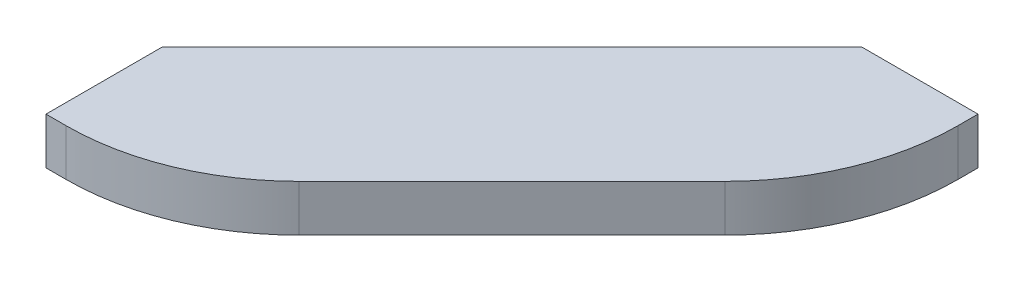
ISO-10303-21;
HEADER;
FILE_DESCRIPTION(('STEP AP214'),'2;1');
FILE_NAME('part.step','',(''),(''),'','','');
FILE_SCHEMA(('AUTOMOTIVE_DESIGN { 1 0 10303 214 1 1 1 1 }'));
ENDSEC;
DATA;
#1=APPLICATION_CONTEXT('core data for automotive mechanical design processes');
#2=APPLICATION_PROTOCOL_DEFINITION('international standard','automotive_design',2000,#1);
#3=PRODUCT_CONTEXT('',#1,'mechanical');
#4=PRODUCT('Part','Part','',(#3));
#5=PRODUCT_RELATED_PRODUCT_CATEGORY('part','',(#4));
#6=PRODUCT_DEFINITION_FORMATION('','',#4);
#7=PRODUCT_DEFINITION_CONTEXT('part definition',#1,'design');
#8=PRODUCT_DEFINITION('design','',#6,#7);
#9=PRODUCT_DEFINITION_SHAPE('','',#8);
#10=(LENGTH_UNIT() NAMED_UNIT(*) SI_UNIT(.MILLI.,.METRE.));
#11=(NAMED_UNIT(*) PLANE_ANGLE_UNIT() SI_UNIT($,.RADIAN.));
#12=(NAMED_UNIT(*) SI_UNIT($,.STERADIAN.) SOLID_ANGLE_UNIT());
#13=UNCERTAINTY_MEASURE_WITH_UNIT(LENGTH_MEASURE(1.E-05),#10,'distance_accuracy_value','');
#14=(GEOMETRIC_REPRESENTATION_CONTEXT(3) GLOBAL_UNCERTAINTY_ASSIGNED_CONTEXT((#13)) GLOBAL_UNIT_ASSIGNED_CONTEXT((#10,
#11,#12)) REPRESENTATION_CONTEXT('',''));
#15=CARTESIAN_POINT('',(0.,0.,0.));
#16=DIRECTION('',(0.,0.,1.));
#17=DIRECTION('',(1.,0.,0.));
#18=AXIS2_PLACEMENT_3D('',#15,#16,#17);
#19=CARTESIAN_POINT('',(25.4,5.08,25.4));
#20=DIRECTION('',(-1.,0.,0.));
#21=DIRECTION('',(0.,0.,1.));
#22=AXIS2_PLACEMENT_3D('',#19,#20,#21);
#23=PLANE('',#22);
#24=DIRECTION('',(0.,0.,-1.));
#25=VECTOR('',#24,1.);
#26=CARTESIAN_POINT('',(25.4,5.08,25.4));
#27=LINE('',#26,#25);
#28=CARTESIAN_POINT('',(25.4,5.08,-23.2210244842766));
#29=VERTEX_POINT('',#28);
#30=CARTESIAN_POINT('',(25.4,5.08,-25.4));
#31=VERTEX_POINT('',#30);
#32=EDGE_CURVE('E123',#29,#31,#27,.T.);
#33=ORIENTED_EDGE('',*,*,#32,.F.);
#34=DIRECTION('',(0.,1.,0.));
#35=VECTOR('',#34,1.);
#36=CARTESIAN_POINT('',(25.4,5.08,-23.2210244842766));
#37=LINE('',#36,#35);
#38=CARTESIAN_POINT('',(25.4,0.,-23.2210244842766));
#39=VERTEX_POINT('',#38);
#40=EDGE_CURVE('E55',#29,#39,#37,.F.);
#41=ORIENTED_EDGE('',*,*,#40,.T.);
#42=DIRECTION('',(0.,0.,-1.));
#43=VECTOR('',#42,1.);
#44=CARTESIAN_POINT('',(25.4,0.,25.4));
#45=LINE('',#44,#43);
#46=CARTESIAN_POINT('',(25.4,0.,-25.4));
#47=VERTEX_POINT('',#46);
#48=EDGE_CURVE('E134',#39,#47,#45,.T.);
#49=ORIENTED_EDGE('',*,*,#48,.T.);
#50=DIRECTION('',(0.,-1.,0.));
#51=VECTOR('',#50,1.);
#52=CARTESIAN_POINT('',(25.4,5.08,-25.4));
#53=LINE('',#52,#51);
#54=EDGE_CURVE('E142',#31,#47,#53,.T.);
#55=ORIENTED_EDGE('',*,*,#54,.F.);
#56=EDGE_LOOP('',(#33,#41,#49,#55));
#57=FACE_BOUND('',#56,.T.);
#58=ADVANCED_FACE('F32',(#57),#23,.F.);
#59=CARTESIAN_POINT('',(-25.4,5.08,-25.4));
#60=DIRECTION('',(0.,0.,1.));
#61=DIRECTION('',(1.,0.,0.));
#62=AXIS2_PLACEMENT_3D('',#59,#60,#61);
#63=PLANE('',#62);
#64=DIRECTION('',(-1.,0.,0.));
#65=VECTOR('',#64,1.);
#66=CARTESIAN_POINT('',(-25.4,0.,-25.4));
#67=LINE('',#66,#65);
#68=CARTESIAN_POINT('',(12.7,0.,-25.4));
#69=VERTEX_POINT('',#68);
#70=EDGE_CURVE('E119',#47,#69,#67,.T.);
#71=ORIENTED_EDGE('',*,*,#70,.T.);
#72=DIRECTION('',(0.,1.,0.));
#73=VECTOR('',#72,1.);
#74=CARTESIAN_POINT('',(12.7,-45.72,-25.4));
#75=LINE('',#74,#73);
#76=CARTESIAN_POINT('',(12.7,5.08,-25.4));
#77=VERTEX_POINT('',#76);
#78=EDGE_CURVE('E102',#69,#77,#75,.T.);
#79=ORIENTED_EDGE('',*,*,#78,.T.);
#80=DIRECTION('',(-1.,0.,0.));
#81=VECTOR('',#80,1.);
#82=CARTESIAN_POINT('',(-25.4,5.08,-25.4));
#83=LINE('',#82,#81);
#84=EDGE_CURVE('E116',#31,#77,#83,.T.);
#85=ORIENTED_EDGE('',*,*,#84,.F.);
#86=ORIENTED_EDGE('',*,*,#54,.T.);
#87=EDGE_LOOP('',(#71,#79,#85,#86));
#88=FACE_BOUND('',#87,.T.);
#89=ADVANCED_FACE('F114',(#88),#63,.F.);
#90=CARTESIAN_POINT('',(-25.4,5.08,25.4));
#91=DIRECTION('',(1.,0.,0.));
#92=DIRECTION('',(0.,0.,-1.));
#93=AXIS2_PLACEMENT_3D('',#90,#91,#92);
#94=PLANE('',#93);
#95=DIRECTION('',(0.,0.,1.));
#96=VECTOR('',#95,1.);
#97=CARTESIAN_POINT('',(-25.4,5.08,25.4));
#98=LINE('',#97,#96);
#99=CARTESIAN_POINT('',(-25.4,5.08,12.7));
#100=VERTEX_POINT('',#99);
#101=CARTESIAN_POINT('',(-25.4,5.08,25.4));
#102=VERTEX_POINT('',#101);
#103=EDGE_CURVE('E124',#100,#102,#98,.T.);
#104=ORIENTED_EDGE('',*,*,#103,.F.);
#105=DIRECTION('',(0.,1.,0.));
#106=VECTOR('',#105,1.);
#107=CARTESIAN_POINT('',(-25.4,-45.72,12.7));
#108=LINE('',#107,#106);
#109=CARTESIAN_POINT('',(-25.4,0.,12.7));
#110=VERTEX_POINT('',#109);
#111=EDGE_CURVE('E105',#110,#100,#108,.T.);
#112=ORIENTED_EDGE('',*,*,#111,.F.);
#113=DIRECTION('',(0.,0.,1.));
#114=VECTOR('',#113,1.);
#115=CARTESIAN_POINT('',(-25.4,0.,25.4));
#116=LINE('',#115,#114);
#117=CARTESIAN_POINT('',(-25.4,0.,25.4));
#118=VERTEX_POINT('',#117);
#119=EDGE_CURVE('E137',#110,#118,#116,.T.);
#120=ORIENTED_EDGE('',*,*,#119,.T.);
#121=DIRECTION('',(0.,-1.,0.));
#122=VECTOR('',#121,1.);
#123=CARTESIAN_POINT('',(-25.4,5.08,25.4));
#124=LINE('',#123,#122);
#125=EDGE_CURVE('E133',#102,#118,#124,.T.);
#126=ORIENTED_EDGE('',*,*,#125,.F.);
#127=EDGE_LOOP('',(#104,#112,#120,#126));
#128=FACE_BOUND('',#127,.T.);
#129=ADVANCED_FACE('F170',(#128),#94,.F.);
#130=CARTESIAN_POINT('',(-25.4,5.08,25.4));
#131=DIRECTION('',(0.,0.,-1.));
#132=DIRECTION('',(-1.,0.,0.));
#133=AXIS2_PLACEMENT_3D('',#130,#131,#132);
#134=PLANE('',#133);
#135=DIRECTION('',(1.,0.,0.));
#136=VECTOR('',#135,1.);
#137=CARTESIAN_POINT('',(-25.4,0.,25.4));
#138=LINE('',#137,#136);
#139=CARTESIAN_POINT('',(-23.2210244842766,0.,25.4));
#140=VERTEX_POINT('',#139);
#141=EDGE_CURVE('E128',#118,#140,#138,.T.);
#142=ORIENTED_EDGE('',*,*,#141,.T.);
#143=DIRECTION('',(0.,1.,0.));
#144=VECTOR('',#143,1.);
#145=CARTESIAN_POINT('',(-23.2210244842766,5.08,25.4));
#146=LINE('',#145,#144);
#147=CARTESIAN_POINT('',(-23.2210244842766,5.08,25.4));
#148=VERTEX_POINT('',#147);
#149=EDGE_CURVE('E11',#140,#148,#146,.T.);
#150=ORIENTED_EDGE('',*,*,#149,.T.);
#151=DIRECTION('',(1.,0.,0.));
#152=VECTOR('',#151,1.);
#153=CARTESIAN_POINT('',(-25.4,5.08,25.4));
#154=LINE('',#153,#152);
#155=EDGE_CURVE('E126',#102,#148,#154,.T.);
#156=ORIENTED_EDGE('',*,*,#155,.F.);
#157=ORIENTED_EDGE('',*,*,#125,.T.);
#158=EDGE_LOOP('',(#142,#150,#156,#157));
#159=FACE_BOUND('',#158,.T.);
#160=ADVANCED_FACE('F178',(#159),#134,.F.);
#161=CARTESIAN_POINT('',(0.,5.08,0.));
#162=DIRECTION('',(0.,-1.,0.));
#163=DIRECTION('',(0.,0.,-1.));
#164=AXIS2_PLACEMENT_3D('',#161,#162,#163);
#165=PLANE('',#164);
#166=DIRECTION('',(-0.707106781186547,0.,0.707106781186548));
#167=VECTOR('',#166,1.);
#168=CARTESIAN_POINT('',(25.4,5.08,-12.7));
#169=LINE('',#168,#167);
#170=CARTESIAN_POINT('',(17.9605122421383,5.08,-5.26051224213832));
#171=VERTEX_POINT('',#170);
#172=CARTESIAN_POINT('',(-5.26051224213828,5.08,17.9605122421383));
#173=VERTEX_POINT('',#172);
#174=EDGE_CURVE('E109',#171,#173,#169,.T.);
#175=ORIENTED_EDGE('',*,*,#174,.F.);
#176=CARTESIAN_POINT('',(0.,5.08,-23.2210244842766));
#177=DIRECTION('',(0.,-1.,0.));
#178=DIRECTION('',(0.,0.,-1.));
#179=AXIS2_PLACEMENT_3D('',#176,#177,#178);
#180=CIRCLE('',#179,25.4);
#181=EDGE_CURVE('E156',#171,#29,#180,.F.);
#182=ORIENTED_EDGE('',*,*,#181,.T.);
#183=ORIENTED_EDGE('',*,*,#32,.T.);
#184=ORIENTED_EDGE('',*,*,#84,.T.);
#185=DIRECTION('',(0.707106781186547,0.,-0.707106781186548));
#186=VECTOR('',#185,1.);
#187=CARTESIAN_POINT('',(-25.4,5.08,12.7));
#188=LINE('',#187,#186);
#189=EDGE_CURVE('E99',#100,#77,#188,.T.);
#190=ORIENTED_EDGE('',*,*,#189,.F.);
#191=ORIENTED_EDGE('',*,*,#103,.T.);
#192=ORIENTED_EDGE('',*,*,#155,.T.);
#193=CARTESIAN_POINT('',(-23.2210244842766,5.08,0.));
#194=DIRECTION('',(0.,-1.,0.));
#195=DIRECTION('',(0.,0.,-1.));
#196=AXIS2_PLACEMENT_3D('',#193,#194,#195);
#197=CIRCLE('',#196,25.4);
#198=EDGE_CURVE('E154',#148,#173,#197,.F.);
#199=ORIENTED_EDGE('',*,*,#198,.T.);
#200=EDGE_LOOP('',(#175,#182,#183,#184,#190,#191,#192,#199));
#201=FACE_BOUND('',#200,.T.);
#202=ADVANCED_FACE('F122',(#201),#165,.F.);
#203=CARTESIAN_POINT('',(0.,0.,0.));
#204=DIRECTION('',(0.,-1.,0.));
#205=DIRECTION('',(0.,0.,-1.));
#206=AXIS2_PLACEMENT_3D('',#203,#204,#205);
#207=PLANE('',#206);
#208=ORIENTED_EDGE('',*,*,#48,.F.);
#209=CARTESIAN_POINT('',(0.,0.,-23.2210244842766));
#210=DIRECTION('',(0.,-1.,0.));
#211=DIRECTION('',(0.,0.,-1.));
#212=AXIS2_PLACEMENT_3D('',#209,#210,#211);
#213=CIRCLE('',#212,25.4);
#214=CARTESIAN_POINT('',(17.9605122421383,0.,-5.26051224213832));
#215=VERTEX_POINT('',#214);
#216=EDGE_CURVE('E40',#39,#215,#213,.T.);
#217=ORIENTED_EDGE('',*,*,#216,.T.);
#218=DIRECTION('',(0.707106781186547,0.,-0.707106781186548));
#219=VECTOR('',#218,1.);
#220=CARTESIAN_POINT('',(6.35000000000001,0.,6.35));
#221=LINE('',#220,#219);
#222=CARTESIAN_POINT('',(-5.26051224213827,0.,17.9605122421383));
#223=VERTEX_POINT('',#222);
#224=EDGE_CURVE('E146',#223,#215,#221,.T.);
#225=ORIENTED_EDGE('',*,*,#224,.F.);
#226=CARTESIAN_POINT('',(-23.2210244842766,0.,0.));
#227=DIRECTION('',(0.,-1.,0.));
#228=DIRECTION('',(0.,0.,-1.));
#229=AXIS2_PLACEMENT_3D('',#226,#227,#228);
#230=CIRCLE('',#229,25.4);
#231=EDGE_CURVE('E47',#223,#140,#230,.T.);
#232=ORIENTED_EDGE('',*,*,#231,.T.);
#233=ORIENTED_EDGE('',*,*,#141,.F.);
#234=ORIENTED_EDGE('',*,*,#119,.F.);
#235=DIRECTION('',(-0.707106781186547,0.,0.707106781186548));
#236=VECTOR('',#235,1.);
#237=CARTESIAN_POINT('',(-6.35000000000001,0.,-6.35));
#238=LINE('',#237,#236);
#239=EDGE_CURVE('E144',#69,#110,#238,.T.);
#240=ORIENTED_EDGE('',*,*,#239,.F.);
#241=ORIENTED_EDGE('',*,*,#70,.F.);
#242=EDGE_LOOP('',(#208,#217,#225,#232,#233,#234,#240,#241));
#243=FACE_BOUND('',#242,.T.);
#244=ADVANCED_FACE('F160',(#243),#207,.T.);
#245=CARTESIAN_POINT('',(-25.4,-45.72,12.7));
#246=DIRECTION('',(0.707106781186548,0.,0.707106781186547));
#247=DIRECTION('',(0.707106781186547,0.,-0.707106781186548));
#248=AXIS2_PLACEMENT_3D('',#245,#246,#247);
#249=PLANE('',#248);
#250=ORIENTED_EDGE('',*,*,#239,.T.);
#251=ORIENTED_EDGE('',*,*,#111,.T.);
#252=ORIENTED_EDGE('',*,*,#189,.T.);
#253=ORIENTED_EDGE('',*,*,#78,.F.);
#254=EDGE_LOOP('',(#250,#251,#252,#253));
#255=FACE_BOUND('',#254,.T.);
#256=ADVANCED_FACE('F101',(#255),#249,.F.);
#257=CARTESIAN_POINT('',(25.4,-45.72,-12.7));
#258=DIRECTION('',(-0.707106781186548,0.,-0.707106781186547));
#259=DIRECTION('',(-0.707106781186547,0.,0.707106781186548));
#260=AXIS2_PLACEMENT_3D('',#257,#258,#259);
#261=PLANE('',#260);
#262=ORIENTED_EDGE('',*,*,#224,.T.);
#263=DIRECTION('',(0.,1.,0.));
#264=VECTOR('',#263,1.);
#265=CARTESIAN_POINT('',(17.9605122421383,-45.72,-5.26051224213832));
#266=LINE('',#265,#264);
#267=EDGE_CURVE('E151',#215,#171,#266,.T.);
#268=ORIENTED_EDGE('',*,*,#267,.T.);
#269=ORIENTED_EDGE('',*,*,#174,.T.);
#270=DIRECTION('',(0.,1.,0.));
#271=VECTOR('',#270,1.);
#272=CARTESIAN_POINT('',(-5.26051224213827,-45.72,17.9605122421383));
#273=LINE('',#272,#271);
#274=EDGE_CURVE('E149',#173,#223,#273,.F.);
#275=ORIENTED_EDGE('',*,*,#274,.T.);
#276=EDGE_LOOP('',(#262,#268,#269,#275));
#277=FACE_BOUND('',#276,.T.);
#278=ADVANCED_FACE('F164',(#277),#261,.F.);
#279=CARTESIAN_POINT('',(0.,-45.72,-23.2210244842766));
#280=DIRECTION('',(0.,1.,0.));
#281=DIRECTION('',(0.,0.,1.));
#282=AXIS2_PLACEMENT_3D('',#279,#280,#281);
#283=CYLINDRICAL_SURFACE('',#282,25.4);
#284=ORIENTED_EDGE('',*,*,#216,.F.);
#285=ORIENTED_EDGE('',*,*,#40,.F.);
#286=ORIENTED_EDGE('',*,*,#181,.F.);
#287=ORIENTED_EDGE('',*,*,#267,.F.);
#288=EDGE_LOOP('',(#284,#285,#286,#287));
#289=FACE_BOUND('',#288,.T.);
#290=ADVANCED_FACE('F167',(#289),#283,.T.);
#291=CARTESIAN_POINT('',(-23.2210244842766,5.08,0.));
#292=DIRECTION('',(0.,1.,0.));
#293=DIRECTION('',(0.,0.,1.));
#294=AXIS2_PLACEMENT_3D('',#291,#292,#293);
#295=CYLINDRICAL_SURFACE('',#294,25.4);
#296=ORIENTED_EDGE('',*,*,#231,.F.);
#297=ORIENTED_EDGE('',*,*,#274,.F.);
#298=ORIENTED_EDGE('',*,*,#198,.F.);
#299=ORIENTED_EDGE('',*,*,#149,.F.);
#300=EDGE_LOOP('',(#296,#297,#298,#299));
#301=FACE_BOUND('',#300,.T.);
#302=ADVANCED_FACE('F34',(#301),#295,.T.);
#303=CLOSED_SHELL('',(#58,#89,#129,#160,#202,#244,#256,#278,#290,#302));
#304=MANIFOLD_SOLID_BREP('B2',#303);
#305=ADVANCED_BREP_SHAPE_REPRESENTATION('',(#18,#304),#14);
#306=SHAPE_DEFINITION_REPRESENTATION(#9,#305);
ENDSEC;
END-ISO-10303-21;
